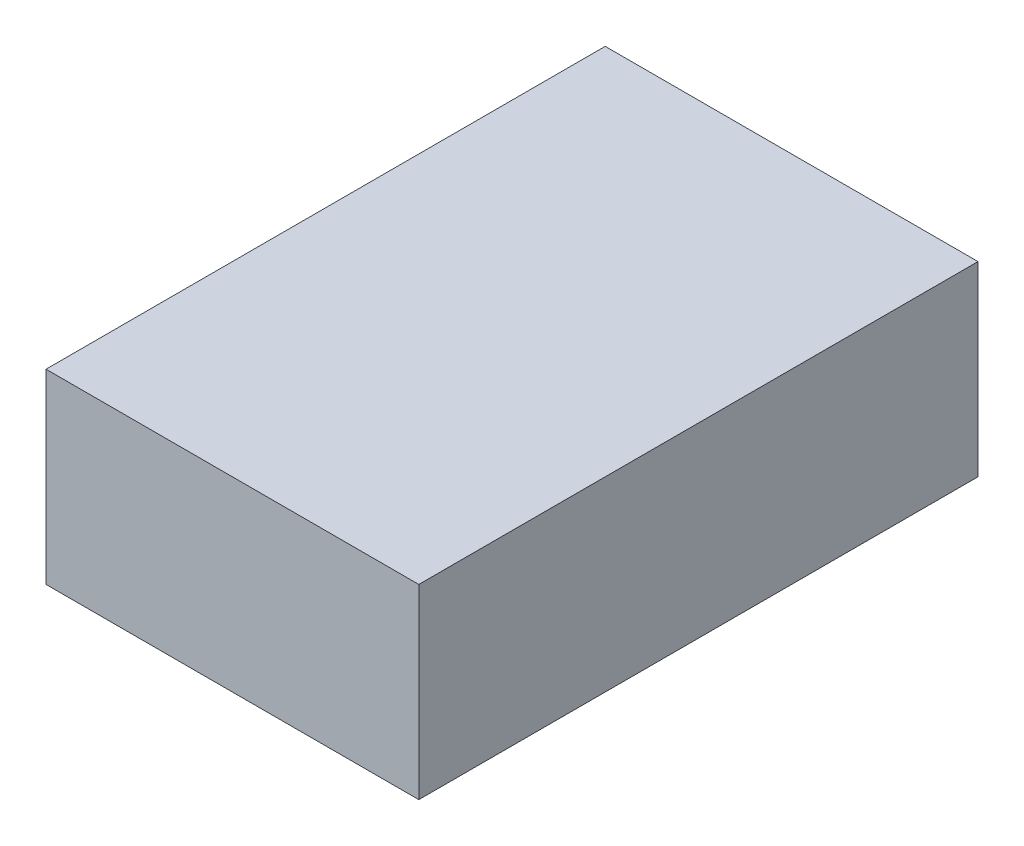
ISO-10303-21;
HEADER;
FILE_DESCRIPTION(('STEP AP214'),'2;1');
FILE_NAME('part.step','',(''),(''),'','','');
FILE_SCHEMA(('AUTOMOTIVE_DESIGN { 1 0 10303 214 1 1 1 1 }'));
ENDSEC;
DATA;
#1=APPLICATION_CONTEXT('core data for automotive mechanical design processes');
#2=APPLICATION_PROTOCOL_DEFINITION('international standard','automotive_design',2000,#1);
#3=PRODUCT_CONTEXT('',#1,'mechanical');
#4=PRODUCT('Part','Part','',(#3));
#5=PRODUCT_RELATED_PRODUCT_CATEGORY('part','',(#4));
#6=PRODUCT_DEFINITION_FORMATION('','',#4);
#7=PRODUCT_DEFINITION_CONTEXT('part definition',#1,'design');
#8=PRODUCT_DEFINITION('design','',#6,#7);
#9=PRODUCT_DEFINITION_SHAPE('','',#8);
#10=(LENGTH_UNIT() NAMED_UNIT(*) SI_UNIT(.MILLI.,.METRE.));
#11=(NAMED_UNIT(*) PLANE_ANGLE_UNIT() SI_UNIT($,.RADIAN.));
#12=(NAMED_UNIT(*) SI_UNIT($,.STERADIAN.) SOLID_ANGLE_UNIT());
#13=UNCERTAINTY_MEASURE_WITH_UNIT(LENGTH_MEASURE(1.E-05),#10,'distance_accuracy_value','');
#14=(GEOMETRIC_REPRESENTATION_CONTEXT(3) GLOBAL_UNCERTAINTY_ASSIGNED_CONTEXT((#13)) GLOBAL_UNIT_ASSIGNED_CONTEXT((#10,
#11,#12)) REPRESENTATION_CONTEXT('',''));
#15=CARTESIAN_POINT('',(0.,0.,0.));
#16=DIRECTION('',(0.,0.,1.));
#17=DIRECTION('',(1.,0.,0.));
#18=AXIS2_PLACEMENT_3D('',#15,#16,#17);
#19=CARTESIAN_POINT('',(0.,0.,0.));
#20=DIRECTION('',(0.,1.,0.));
#21=DIRECTION('',(1.,0.,0.));
#22=AXIS2_PLACEMENT_3D('',#19,#20,#21);
#23=PLANE('',#22);
#24=DIRECTION('',(1.,0.,0.));
#25=VECTOR('',#24,1.);
#26=CARTESIAN_POINT('',(-9.25,0.,-10.9215657458441));
#27=LINE('',#26,#25);
#28=CARTESIAN_POINT('',(-5.47698077858949,0.,-10.9215657458441));
#29=VERTEX_POINT('',#28);
#30=CARTESIAN_POINT('',(-4.47698077858948,0.,-10.9215657458441));
#31=VERTEX_POINT('',#30);
#32=EDGE_CURVE('E112',#29,#31,#27,.T.);
#33=ORIENTED_EDGE('',*,*,#32,.F.);
#34=DIRECTION('',(0.,0.,-1.));
#35=VECTOR('',#34,1.);
#36=CARTESIAN_POINT('',(-5.47698077858949,0.,-0.65));
#37=LINE('',#36,#35);
#38=CARTESIAN_POINT('',(-5.47698077858949,0.,-9.42156574584414));
#39=VERTEX_POINT('',#38);
#40=EDGE_CURVE('E25',#39,#29,#37,.T.);
#41=ORIENTED_EDGE('',*,*,#40,.F.);
#42=DIRECTION('',(1.,0.,0.));
#43=VECTOR('',#42,1.);
#44=CARTESIAN_POINT('',(-9.25,0.,-9.42156574584414));
#45=LINE('',#44,#43);
#46=CARTESIAN_POINT('',(-4.47698077858948,0.,-9.42156574584414));
#47=VERTEX_POINT('',#46);
#48=EDGE_CURVE('E67',#39,#47,#45,.T.);
#49=ORIENTED_EDGE('',*,*,#48,.T.);
#50=DIRECTION('',(0.,0.,-1.));
#51=VECTOR('',#50,1.);
#52=CARTESIAN_POINT('',(-4.47698077858948,0.,-0.65));
#53=LINE('',#52,#51);
#54=EDGE_CURVE('E70',#47,#31,#53,.T.);
#55=ORIENTED_EDGE('',*,*,#54,.T.);
#56=EDGE_LOOP('',(#33,#41,#49,#55));
#57=FACE_BOUND('',#56,.T.);
#58=ADVANCED_FACE('F17',(#57),#23,.T.);
#59=CARTESIAN_POINT('',(0.,-0.5,0.));
#60=DIRECTION('',(0.,1.,0.));
#61=DIRECTION('',(1.,0.,0.));
#62=AXIS2_PLACEMENT_3D('',#59,#60,#61);
#63=PLANE('',#62);
#64=DIRECTION('',(1.,0.,0.));
#65=VECTOR('',#64,1.);
#66=CARTESIAN_POINT('',(-9.25,-0.5,-10.9215657458441));
#67=LINE('',#66,#65);
#68=CARTESIAN_POINT('',(-5.47698077858949,-0.5,-10.9215657458441));
#69=VERTEX_POINT('',#68);
#70=CARTESIAN_POINT('',(-4.47698077858948,-0.5,-10.9215657458441));
#71=VERTEX_POINT('',#70);
#72=EDGE_CURVE('E98',#69,#71,#67,.T.);
#73=ORIENTED_EDGE('',*,*,#72,.T.);
#74=DIRECTION('',(0.,0.,-1.));
#75=VECTOR('',#74,1.);
#76=CARTESIAN_POINT('',(-4.47698077858948,-0.5,-0.65));
#77=LINE('',#76,#75);
#78=CARTESIAN_POINT('',(-4.47698077858948,-0.5,-9.42156574584414));
#79=VERTEX_POINT('',#78);
#80=EDGE_CURVE('E76',#79,#71,#77,.T.);
#81=ORIENTED_EDGE('',*,*,#80,.F.);
#82=DIRECTION('',(1.,0.,0.));
#83=VECTOR('',#82,1.);
#84=CARTESIAN_POINT('',(-9.25,-0.5,-9.42156574584414));
#85=LINE('',#84,#83);
#86=CARTESIAN_POINT('',(-5.47698077858949,-0.5,-9.42156574584414));
#87=VERTEX_POINT('',#86);
#88=EDGE_CURVE('E81',#87,#79,#85,.T.);
#89=ORIENTED_EDGE('',*,*,#88,.F.);
#90=DIRECTION('',(0.,0.,-1.));
#91=VECTOR('',#90,1.);
#92=CARTESIAN_POINT('',(-5.47698077858949,-0.5,-0.65));
#93=LINE('',#92,#91);
#94=EDGE_CURVE('E11',#87,#69,#93,.T.);
#95=ORIENTED_EDGE('',*,*,#94,.T.);
#96=EDGE_LOOP('',(#73,#81,#89,#95));
#97=FACE_BOUND('',#96,.T.);
#98=ADVANCED_FACE('F125',(#97),#63,.F.);
#99=CARTESIAN_POINT('',(-5.47698077858949,-0.5,-0.65));
#100=DIRECTION('',(1.,0.,0.));
#101=DIRECTION('',(0.,1.,0.));
#102=AXIS2_PLACEMENT_3D('',#99,#100,#101);
#103=PLANE('',#102);
#104=ORIENTED_EDGE('',*,*,#40,.T.);
#105=DIRECTION('',(0.,1.,0.));
#106=VECTOR('',#105,1.);
#107=CARTESIAN_POINT('',(-5.47698077858949,-0.5,-10.9215657458441));
#108=LINE('',#107,#106);
#109=EDGE_CURVE('E91',#69,#29,#108,.T.);
#110=ORIENTED_EDGE('',*,*,#109,.F.);
#111=ORIENTED_EDGE('',*,*,#94,.F.);
#112=DIRECTION('',(0.,1.,0.));
#113=VECTOR('',#112,1.);
#114=CARTESIAN_POINT('',(-5.47698077858949,-0.5,-9.42156574584414));
#115=LINE('',#114,#113);
#116=EDGE_CURVE('E75',#87,#39,#115,.T.);
#117=ORIENTED_EDGE('',*,*,#116,.T.);
#118=EDGE_LOOP('',(#104,#110,#111,#117));
#119=FACE_BOUND('',#118,.T.);
#120=ADVANCED_FACE('F108',(#119),#103,.F.);
#121=CARTESIAN_POINT('',(-9.25,-0.5,-9.42156574584414));
#122=DIRECTION('',(0.,0.,1.));
#123=DIRECTION('',(1.,0.,0.));
#124=AXIS2_PLACEMENT_3D('',#121,#122,#123);
#125=PLANE('',#124);
#126=ORIENTED_EDGE('',*,*,#48,.F.);
#127=ORIENTED_EDGE('',*,*,#116,.F.);
#128=ORIENTED_EDGE('',*,*,#88,.T.);
#129=DIRECTION('',(0.,1.,0.));
#130=VECTOR('',#129,1.);
#131=CARTESIAN_POINT('',(-4.47698077858948,-0.5,-9.42156574584414));
#132=LINE('',#131,#130);
#133=EDGE_CURVE('E79',#79,#47,#132,.T.);
#134=ORIENTED_EDGE('',*,*,#133,.T.);
#135=EDGE_LOOP('',(#126,#127,#128,#134));
#136=FACE_BOUND('',#135,.T.);
#137=ADVANCED_FACE('F80',(#136),#125,.T.);
#138=CARTESIAN_POINT('',(-4.47698077858948,-0.5,-0.65));
#139=DIRECTION('',(1.,0.,0.));
#140=DIRECTION('',(0.,1.,0.));
#141=AXIS2_PLACEMENT_3D('',#138,#139,#140);
#142=PLANE('',#141);
#143=ORIENTED_EDGE('',*,*,#54,.F.);
#144=ORIENTED_EDGE('',*,*,#133,.F.);
#145=ORIENTED_EDGE('',*,*,#80,.T.);
#146=DIRECTION('',(0.,1.,0.));
#147=VECTOR('',#146,1.);
#148=CARTESIAN_POINT('',(-4.47698077858948,-0.5,-10.9215657458441));
#149=LINE('',#148,#147);
#150=EDGE_CURVE('E88',#71,#31,#149,.T.);
#151=ORIENTED_EDGE('',*,*,#150,.T.);
#152=EDGE_LOOP('',(#143,#144,#145,#151));
#153=FACE_BOUND('',#152,.T.);
#154=ADVANCED_FACE('F86',(#153),#142,.T.);
#155=CARTESIAN_POINT('',(-9.25,-0.5,-10.9215657458441));
#156=DIRECTION('',(0.,0.,1.));
#157=DIRECTION('',(1.,0.,0.));
#158=AXIS2_PLACEMENT_3D('',#155,#156,#157);
#159=PLANE('',#158);
#160=ORIENTED_EDGE('',*,*,#32,.T.);
#161=ORIENTED_EDGE('',*,*,#150,.F.);
#162=ORIENTED_EDGE('',*,*,#72,.F.);
#163=ORIENTED_EDGE('',*,*,#109,.T.);
#164=EDGE_LOOP('',(#160,#161,#162,#163));
#165=FACE_BOUND('',#164,.T.);
#166=ADVANCED_FACE('F111',(#165),#159,.F.);
#167=CLOSED_SHELL('',(#58,#98,#120,#137,#154,#166));
#168=MANIFOLD_SOLID_BREP('B1',#167);
#169=ADVANCED_BREP_SHAPE_REPRESENTATION('',(#18,#168),#14);
#170=SHAPE_DEFINITION_REPRESENTATION(#9,#169);
ENDSEC;
END-ISO-10303-21;
